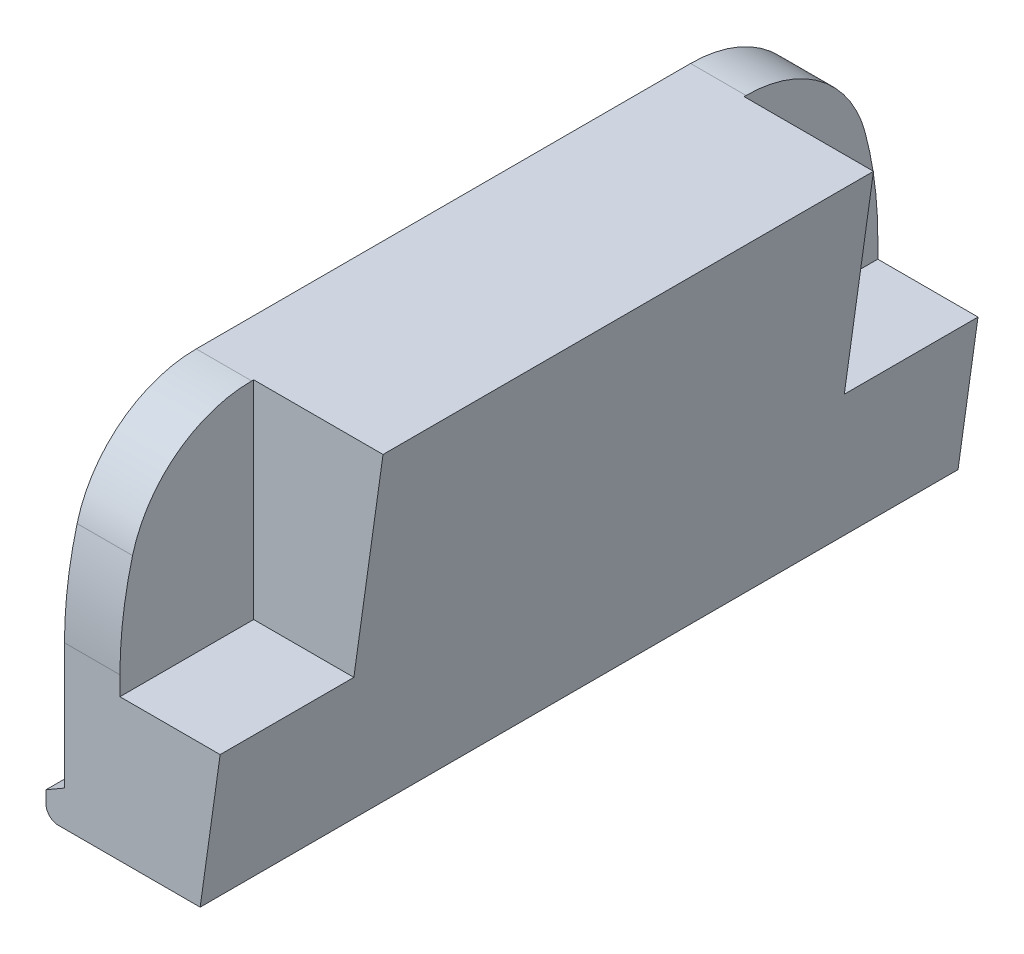
ISO-10303-21;
HEADER;
FILE_DESCRIPTION(('STEP AP214'),'2;1');
FILE_NAME('part.step','',(''),(''),'','','');
FILE_SCHEMA(('AUTOMOTIVE_DESIGN { 1 0 10303 214 1 1 1 1 }'));
ENDSEC;
DATA;
#1=APPLICATION_CONTEXT('core data for automotive mechanical design processes');
#2=APPLICATION_PROTOCOL_DEFINITION('international standard','automotive_design',2000,#1);
#3=PRODUCT_CONTEXT('',#1,'mechanical');
#4=PRODUCT('Part','Part','',(#3));
#5=PRODUCT_RELATED_PRODUCT_CATEGORY('part','',(#4));
#6=PRODUCT_DEFINITION_FORMATION('','',#4);
#7=PRODUCT_DEFINITION_CONTEXT('part definition',#1,'design');
#8=PRODUCT_DEFINITION('design','',#6,#7);
#9=PRODUCT_DEFINITION_SHAPE('','',#8);
#10=(LENGTH_UNIT() NAMED_UNIT(*) SI_UNIT(.MILLI.,.METRE.));
#11=(NAMED_UNIT(*) PLANE_ANGLE_UNIT() SI_UNIT($,.RADIAN.));
#12=(NAMED_UNIT(*) SI_UNIT($,.STERADIAN.) SOLID_ANGLE_UNIT());
#13=UNCERTAINTY_MEASURE_WITH_UNIT(LENGTH_MEASURE(1.E-05),#10,'distance_accuracy_value','');
#14=(GEOMETRIC_REPRESENTATION_CONTEXT(3) GLOBAL_UNCERTAINTY_ASSIGNED_CONTEXT((#13)) GLOBAL_UNIT_ASSIGNED_CONTEXT((#10,
#11,#12)) REPRESENTATION_CONTEXT('',''));
#15=CARTESIAN_POINT('',(0.,0.,0.));
#16=DIRECTION('',(0.,0.,1.));
#17=DIRECTION('',(1.,0.,0.));
#18=AXIS2_PLACEMENT_3D('',#15,#16,#17);
#19=CARTESIAN_POINT('',(0.299997713090983,1.78159871871872,12.3));
#20=DIRECTION('',(1.,0.,0.));
#21=DIRECTION('',(0.,0.,-1.));
#22=AXIS2_PLACEMENT_3D('',#19,#20,#21);
#23=PLANE('',#22);
#24=CARTESIAN_POINT('',(0.299997713090983,2.21592966698313,6.14964107341044));
#25=DIRECTION('',(1.,0.,0.));
#26=DIRECTION('',(0.,0.,1.));
#27=AXIS2_PLACEMENT_3D('',#24,#25,#26);
#28=CIRCLE('',#27,6.15035892658956);
#29=CARTESIAN_POINT('',(0.299997713090983,3.78899475901144,12.095427913024));
#30=VERTEX_POINT('',#29);
#31=CARTESIAN_POINT('',(0.299997713090983,2.21592966698313,12.3));
#32=VERTEX_POINT('',#31);
#33=EDGE_CURVE('E248',#30,#32,#28,.T.);
#34=ORIENTED_EDGE('',*,*,#33,.F.);
#35=CARTESIAN_POINT('',(0.299997713090983,3.27745872971482,10.1619515385287));
#36=DIRECTION('',(1.,0.,0.));
#37=DIRECTION('',(0.,0.,-1.));
#38=AXIS2_PLACEMENT_3D('',#35,#36,#37);
#39=CIRCLE('',#38,2.);
#40=CARTESIAN_POINT('',(0.299997713090983,5.27745872971482,10.1619515385287));
#41=VERTEX_POINT('',#40);
#42=EDGE_CURVE('E227',#30,#41,#39,.F.);
#43=ORIENTED_EDGE('',*,*,#42,.T.);
#44=DIRECTION('',(0.,0.,1.));
#45=VECTOR('',#44,1.);
#46=CARTESIAN_POINT('',(0.299997713090983,5.27745872971482,-0.552242211652792));
#47=LINE('',#46,#45);
#48=CARTESIAN_POINT('',(0.299997713090983,5.27745872971482,2.13804846147129));
#49=VERTEX_POINT('',#48);
#50=EDGE_CURVE('E318',#49,#41,#47,.T.);
#51=ORIENTED_EDGE('',*,*,#50,.F.);
#52=CARTESIAN_POINT('',(0.299997713090983,3.27745872971482,2.13804846147129));
#53=DIRECTION('',(1.,0.,0.));
#54=DIRECTION('',(0.,0.,-1.));
#55=AXIS2_PLACEMENT_3D('',#52,#53,#54);
#56=CIRCLE('',#55,2.);
#57=CARTESIAN_POINT('',(0.299997713090983,3.78899475901144,0.204572086976));
#58=VERTEX_POINT('',#57);
#59=EDGE_CURVE('E225',#49,#58,#56,.F.);
#60=ORIENTED_EDGE('',*,*,#59,.T.);
#61=CARTESIAN_POINT('',(0.299997713090983,2.21592966698313,6.15035892658956));
#62=DIRECTION('',(1.,0.,0.));
#63=DIRECTION('',(0.,0.,-1.));
#64=AXIS2_PLACEMENT_3D('',#61,#62,#63);
#65=CIRCLE('',#64,6.15035892658956);
#66=CARTESIAN_POINT('',(0.299997713090983,2.21592966698313,0.));
#67=VERTEX_POINT('',#66);
#68=EDGE_CURVE('E240',#67,#58,#65,.T.);
#69=ORIENTED_EDGE('',*,*,#68,.F.);
#70=DIRECTION('',(0.,-1.,0.));
#71=VECTOR('',#70,1.);
#72=CARTESIAN_POINT('',(0.299997713090983,1.78159871871872,0.));
#73=LINE('',#72,#71);
#74=CARTESIAN_POINT('',(0.299997713090983,0.173208718718719,0.));
#75=VERTEX_POINT('',#74);
#76=EDGE_CURVE('E200',#67,#75,#73,.T.);
#77=ORIENTED_EDGE('',*,*,#76,.T.);
#78=DIRECTION('',(0.,0.,-1.));
#79=VECTOR('',#78,1.);
#80=CARTESIAN_POINT('',(0.299997713090983,0.173208718718719,12.3));
#81=LINE('',#80,#79);
#82=CARTESIAN_POINT('',(0.299997713090983,0.173208718718719,12.3));
#83=VERTEX_POINT('',#82);
#84=EDGE_CURVE('E214',#83,#75,#81,.T.);
#85=ORIENTED_EDGE('',*,*,#84,.F.);
#86=DIRECTION('',(0.,-1.,0.));
#87=VECTOR('',#86,1.);
#88=CARTESIAN_POINT('',(0.299997713090982,6.10745871871872,12.3));
#89=LINE('',#88,#87);
#90=EDGE_CURVE('E294',#32,#83,#89,.T.);
#91=ORIENTED_EDGE('',*,*,#90,.F.);
#92=EDGE_LOOP('',(#34,#43,#51,#60,#69,#77,#85,#91));
#93=FACE_BOUND('',#92,.T.);
#94=DIRECTION('',(0.,0.,1.));
#95=VECTOR('',#94,1.);
#96=CARTESIAN_POINT('',(0.299997713090983,4.37320871871872,2.9660396702713));
#97=LINE('',#96,#95);
#98=CARTESIAN_POINT('',(0.299997713090983,4.37320871871872,4.65));
#99=VERTEX_POINT('',#98);
#100=CARTESIAN_POINT('',(0.299997713090983,4.37320871871872,7.65));
#101=VERTEX_POINT('',#100);
#102=EDGE_CURVE('E341',#99,#101,#97,.T.);
#103=ORIENTED_EDGE('',*,*,#102,.T.);
#104=DIRECTION('',(0.,1.,0.));
#105=VECTOR('',#104,1.);
#106=CARTESIAN_POINT('',(0.299997713090983,2.78159871871872,7.65));
#107=LINE('',#106,#105);
#108=CARTESIAN_POINT('',(0.299997713090983,1.78159871871872,7.65));
#109=VERTEX_POINT('',#108);
#110=EDGE_CURVE('E350',#109,#101,#107,.T.);
#111=ORIENTED_EDGE('',*,*,#110,.F.);
#112=DIRECTION('',(0.,0.,1.));
#113=VECTOR('',#112,1.);
#114=CARTESIAN_POINT('',(0.299997713090983,1.78159871871872,4.65));
#115=LINE('',#114,#113);
#116=CARTESIAN_POINT('',(0.299997713090983,1.78159871871872,4.65));
#117=VERTEX_POINT('',#116);
#118=EDGE_CURVE('E361',#117,#109,#115,.T.);
#119=ORIENTED_EDGE('',*,*,#118,.F.);
#120=DIRECTION('',(0.,-1.,0.));
#121=VECTOR('',#120,1.);
#122=CARTESIAN_POINT('',(0.299997713090983,2.78159871871872,4.65));
#123=LINE('',#122,#121);
#124=EDGE_CURVE('E340',#99,#117,#123,.T.);
#125=ORIENTED_EDGE('',*,*,#124,.F.);
#126=EDGE_LOOP('',(#103,#111,#119,#125));
#127=FACE_BOUND('',#126,.T.);
#128=ADVANCED_FACE('F33',(#93,#127),#23,.F.);
#129=CARTESIAN_POINT('',(0.2,-0.2,0.));
#130=DIRECTION('',(0.,0.,-1.));
#131=DIRECTION('',(-1.,0.,0.));
#132=AXIS2_PLACEMENT_3D('',#129,#130,#131);
#133=PLANE('',#132);
#134=DIRECTION('',(-0.139173100960058,-0.990268068741571,0.));
#135=VECTOR('',#134,1.);
#136=CARTESIAN_POINT('',(2.50208292422852,-0.4,0.));
#137=LINE('',#136,#135);
#138=CARTESIAN_POINT('',(2.82637509859855,1.90745871871872,0.));
#139=VERTEX_POINT('',#138);
#140=CARTESIAN_POINT('',(2.50208292422852,-0.4,0.));
#141=VERTEX_POINT('',#140);
#142=EDGE_CURVE('E178',#139,#141,#137,.T.);
#143=ORIENTED_EDGE('',*,*,#142,.T.);
#144=DIRECTION('',(1.,0.,0.));
#145=VECTOR('',#144,1.);
#146=CARTESIAN_POINT('',(3.29999771309098,-0.399999999999999,0.));
#147=LINE('',#146,#145);
#148=CARTESIAN_POINT('',(0.200000000000001,-0.4,0.));
#149=VERTEX_POINT('',#148);
#150=EDGE_CURVE('E192',#149,#141,#147,.T.);
#151=ORIENTED_EDGE('',*,*,#150,.F.);
#152=CARTESIAN_POINT('',(0.2,-0.2,0.));
#153=DIRECTION('',(0.,0.,1.));
#154=DIRECTION('',(-1.,0.,0.));
#155=AXIS2_PLACEMENT_3D('',#152,#153,#154);
#156=CIRCLE('',#155,0.2);
#157=CARTESIAN_POINT('',(0.,-0.199999999999999,0.));
#158=VERTEX_POINT('',#157);
#159=EDGE_CURVE('E201',#158,#149,#156,.T.);
#160=ORIENTED_EDGE('',*,*,#159,.F.);
#161=DIRECTION('',(0.,-1.,0.));
#162=VECTOR('',#161,1.);
#163=CARTESIAN_POINT('',(0.,0.,0.));
#164=LINE('',#163,#162);
#165=CARTESIAN_POINT('',(0.,0.,0.));
#166=VERTEX_POINT('',#165);
#167=EDGE_CURVE('E205',#166,#158,#164,.T.);
#168=ORIENTED_EDGE('',*,*,#167,.F.);
#169=DIRECTION('',(-0.866019205828305,-0.500010735021271,0.));
#170=VECTOR('',#169,1.);
#171=CARTESIAN_POINT('',(0.,0.,0.));
#172=LINE('',#171,#170);
#173=EDGE_CURVE('E203',#75,#166,#172,.T.);
#174=ORIENTED_EDGE('',*,*,#173,.F.);
#175=ORIENTED_EDGE('',*,*,#76,.F.);
#176=DIRECTION('',(-1.,0.,0.));
#177=VECTOR('',#176,1.);
#178=CARTESIAN_POINT('',(5.52551835218582,2.21592966698313,0.));
#179=LINE('',#178,#177);
#180=CARTESIAN_POINT('',(1.19999771309098,2.21592966698313,0.));
#181=VERTEX_POINT('',#180);
#182=EDGE_CURVE('E249',#181,#67,#179,.T.);
#183=ORIENTED_EDGE('',*,*,#182,.F.);
#184=DIRECTION('',(0.,1.,0.));
#185=VECTOR('',#184,1.);
#186=CARTESIAN_POINT('',(1.19999771309098,1.90745871871872,0.));
#187=LINE('',#186,#185);
#188=CARTESIAN_POINT('',(1.19999771309098,1.90745871871872,0.));
#189=VERTEX_POINT('',#188);
#190=EDGE_CURVE('E247',#189,#181,#187,.T.);
#191=ORIENTED_EDGE('',*,*,#190,.F.);
#192=DIRECTION('',(-1.,0.,0.));
#193=VECTOR('',#192,1.);
#194=CARTESIAN_POINT('',(3.29999771309098,1.90745871871872,0.));
#195=LINE('',#194,#193);
#196=EDGE_CURVE('E194',#139,#189,#195,.T.);
#197=ORIENTED_EDGE('',*,*,#196,.F.);
#198=EDGE_LOOP('',(#143,#151,#160,#168,#174,#175,#183,#191,#197));
#199=FACE_BOUND('',#198,.T.);
#200=ADVANCED_FACE('F191',(#199),#133,.T.);
#201=CARTESIAN_POINT('',(0.2,-0.2,12.3));
#202=DIRECTION('',(0.,0.,-1.));
#203=DIRECTION('',(-1.,0.,0.));
#204=AXIS2_PLACEMENT_3D('',#201,#202,#203);
#205=PLANE('',#204);
#206=DIRECTION('',(1.,0.,0.));
#207=VECTOR('',#206,1.);
#208=CARTESIAN_POINT('',(3.29999771309098,-0.399999999999999,12.3));
#209=LINE('',#208,#207);
#210=CARTESIAN_POINT('',(0.200000000000001,-0.4,12.3));
#211=VERTEX_POINT('',#210);
#212=CARTESIAN_POINT('',(2.50208292422852,-0.4,12.3));
#213=VERTEX_POINT('',#212);
#214=EDGE_CURVE('E292',#211,#213,#209,.T.);
#215=ORIENTED_EDGE('',*,*,#214,.T.);
#216=DIRECTION('',(-0.139173100960058,-0.990268068741571,0.));
#217=VECTOR('',#216,1.);
#218=CARTESIAN_POINT('',(2.50208292422852,-0.4,12.3));
#219=LINE('',#218,#217);
#220=CARTESIAN_POINT('',(2.82637509859855,1.90745871871872,12.3));
#221=VERTEX_POINT('',#220);
#222=EDGE_CURVE('E181',#221,#213,#219,.T.);
#223=ORIENTED_EDGE('',*,*,#222,.F.);
#224=DIRECTION('',(1.,0.,0.));
#225=VECTOR('',#224,1.);
#226=CARTESIAN_POINT('',(3.29999771309098,1.90745871871872,12.3));
#227=LINE('',#226,#225);
#228=CARTESIAN_POINT('',(1.19999771309098,1.90745871871872,12.3));
#229=VERTEX_POINT('',#228);
#230=EDGE_CURVE('E268',#229,#221,#227,.T.);
#231=ORIENTED_EDGE('',*,*,#230,.F.);
#232=DIRECTION('',(0.,1.,0.));
#233=VECTOR('',#232,1.);
#234=CARTESIAN_POINT('',(1.19999771309098,1.90745871871872,12.3));
#235=LINE('',#234,#233);
#236=CARTESIAN_POINT('',(1.19999771309098,2.21592966698313,12.3));
#237=VERTEX_POINT('',#236);
#238=EDGE_CURVE('E272',#229,#237,#235,.T.);
#239=ORIENTED_EDGE('',*,*,#238,.T.);
#240=DIRECTION('',(-1.,0.,0.));
#241=VECTOR('',#240,1.);
#242=CARTESIAN_POINT('',(5.52551835218582,2.21592966698313,12.3));
#243=LINE('',#242,#241);
#244=EDGE_CURVE('E251',#237,#32,#243,.T.);
#245=ORIENTED_EDGE('',*,*,#244,.T.);
#246=ORIENTED_EDGE('',*,*,#90,.T.);
#247=DIRECTION('',(-0.866019205828305,-0.500010735021271,0.));
#248=VECTOR('',#247,1.);
#249=CARTESIAN_POINT('',(0.,0.,12.3));
#250=LINE('',#249,#248);
#251=CARTESIAN_POINT('',(0.,0.,12.3));
#252=VERTEX_POINT('',#251);
#253=EDGE_CURVE('E215',#83,#252,#250,.T.);
#254=ORIENTED_EDGE('',*,*,#253,.T.);
#255=DIRECTION('',(0.,-1.,0.));
#256=VECTOR('',#255,1.);
#257=CARTESIAN_POINT('',(0.,0.,12.3));
#258=LINE('',#257,#256);
#259=CARTESIAN_POINT('',(0.,-0.199999999999999,12.3));
#260=VERTEX_POINT('',#259);
#261=EDGE_CURVE('E210',#252,#260,#258,.T.);
#262=ORIENTED_EDGE('',*,*,#261,.T.);
#263=CARTESIAN_POINT('',(0.2,-0.2,12.3));
#264=DIRECTION('',(0.,0.,1.));
#265=DIRECTION('',(-1.,0.,0.));
#266=AXIS2_PLACEMENT_3D('',#263,#264,#265);
#267=CIRCLE('',#266,0.2);
#268=EDGE_CURVE('E290',#260,#211,#267,.T.);
#269=ORIENTED_EDGE('',*,*,#268,.T.);
#270=EDGE_LOOP('',(#215,#223,#231,#239,#245,#246,#254,#262,#269));
#271=FACE_BOUND('',#270,.T.);
#272=ADVANCED_FACE('F308',(#271),#205,.F.);
#273=CARTESIAN_POINT('',(0.,0.,12.3));
#274=DIRECTION('',(1.,0.,0.));
#275=DIRECTION('',(0.,1.,0.));
#276=AXIS2_PLACEMENT_3D('',#273,#274,#275);
#277=PLANE('',#276);
#278=ORIENTED_EDGE('',*,*,#167,.T.);
#279=DIRECTION('',(0.,0.,-1.));
#280=VECTOR('',#279,1.);
#281=CARTESIAN_POINT('',(0.,-0.199999999999999,12.3));
#282=LINE('',#281,#280);
#283=EDGE_CURVE('E219',#260,#158,#282,.T.);
#284=ORIENTED_EDGE('',*,*,#283,.F.);
#285=ORIENTED_EDGE('',*,*,#261,.F.);
#286=DIRECTION('',(0.,0.,-1.));
#287=VECTOR('',#286,1.);
#288=CARTESIAN_POINT('',(0.,0.,12.3));
#289=LINE('',#288,#287);
#290=EDGE_CURVE('E211',#252,#166,#289,.T.);
#291=ORIENTED_EDGE('',*,*,#290,.T.);
#292=EDGE_LOOP('',(#278,#284,#285,#291));
#293=FACE_BOUND('',#292,.T.);
#294=ADVANCED_FACE('F300',(#293),#277,.F.);
#295=CARTESIAN_POINT('',(0.2,-0.2,12.3));
#296=DIRECTION('',(0.,0.,-1.));
#297=DIRECTION('',(-1.,0.,0.));
#298=AXIS2_PLACEMENT_3D('',#295,#296,#297);
#299=CYLINDRICAL_SURFACE('',#298,0.2);
#300=ORIENTED_EDGE('',*,*,#159,.T.);
#301=DIRECTION('',(0.,0.,-1.));
#302=VECTOR('',#301,1.);
#303=CARTESIAN_POINT('',(0.200000000000001,-0.4,12.3));
#304=LINE('',#303,#302);
#305=EDGE_CURVE('E199',#211,#149,#304,.T.);
#306=ORIENTED_EDGE('',*,*,#305,.F.);
#307=ORIENTED_EDGE('',*,*,#268,.F.);
#308=ORIENTED_EDGE('',*,*,#283,.T.);
#309=EDGE_LOOP('',(#300,#306,#307,#308));
#310=FACE_BOUND('',#309,.T.);
#311=ADVANCED_FACE('F306',(#310),#299,.T.);
#312=CARTESIAN_POINT('',(3.29999771309098,-0.399999999999999,12.3));
#313=DIRECTION('',(0.,1.,0.));
#314=DIRECTION('',(-1.,0.,0.));
#315=AXIS2_PLACEMENT_3D('',#312,#313,#314);
#316=PLANE('',#315);
#317=ORIENTED_EDGE('',*,*,#150,.T.);
#318=DIRECTION('',(0.,0.,1.));
#319=VECTOR('',#318,1.);
#320=CARTESIAN_POINT('',(2.50208292422852,-0.4,0.));
#321=LINE('',#320,#319);
#322=EDGE_CURVE('E175',#141,#213,#321,.T.);
#323=ORIENTED_EDGE('',*,*,#322,.T.);
#324=ORIENTED_EDGE('',*,*,#214,.F.);
#325=ORIENTED_EDGE('',*,*,#305,.T.);
#326=EDGE_LOOP('',(#317,#323,#324,#325));
#327=FACE_BOUND('',#326,.T.);
#328=ADVANCED_FACE('F197',(#327),#316,.F.);
#329=CARTESIAN_POINT('',(0.,0.,12.3));
#330=DIRECTION('',(0.500010735021271,-0.866019205828305,0.));
#331=DIRECTION('',(0.866019205828305,0.500010735021271,0.));
#332=AXIS2_PLACEMENT_3D('',#329,#330,#331);
#333=PLANE('',#332);
#334=ORIENTED_EDGE('',*,*,#173,.T.);
#335=ORIENTED_EDGE('',*,*,#290,.F.);
#336=ORIENTED_EDGE('',*,*,#253,.F.);
#337=ORIENTED_EDGE('',*,*,#84,.T.);
#338=EDGE_LOOP('',(#334,#335,#336,#337));
#339=FACE_BOUND('',#338,.T.);
#340=ADVANCED_FACE('F313',(#339),#333,.F.);
#341=CARTESIAN_POINT('',(3.29999771309098,1.90745871871872,2.17));
#342=DIRECTION('',(0.,0.,1.));
#343=DIRECTION('',(1.,0.,0.));
#344=AXIS2_PLACEMENT_3D('',#341,#342,#343);
#345=PLANE('',#344);
#346=DIRECTION('',(1.,0.,0.));
#347=VECTOR('',#346,1.);
#348=CARTESIAN_POINT('',(3.29999771309098,5.27745872971482,2.17));
#349=LINE('',#348,#347);
#350=CARTESIAN_POINT('',(1.19999771309098,5.27745872971482,2.17));
#351=VERTEX_POINT('',#350);
#352=CARTESIAN_POINT('',(3.29999771309098,5.27745872971482,2.17));
#353=VERTEX_POINT('',#352);
#354=EDGE_CURVE('E324',#351,#353,#349,.T.);
#355=ORIENTED_EDGE('',*,*,#354,.T.);
#356=DIRECTION('',(-0.139173100960058,-0.990268068741571,0.));
#357=VECTOR('',#356,1.);
#358=CARTESIAN_POINT('',(2.83554876702389,1.97273276127563,2.17));
#359=LINE('',#358,#357);
#360=CARTESIAN_POINT('',(2.82637509859855,1.90745871871872,2.17));
#361=VERTEX_POINT('',#360);
#362=EDGE_CURVE('E435',#353,#361,#359,.T.);
#363=ORIENTED_EDGE('',*,*,#362,.T.);
#364=DIRECTION('',(1.,0.,0.));
#365=VECTOR('',#364,1.);
#366=CARTESIAN_POINT('',(3.29999771309098,1.90745871871872,2.17));
#367=LINE('',#366,#365);
#368=CARTESIAN_POINT('',(1.19999771309098,1.90745871871872,2.17));
#369=VERTEX_POINT('',#368);
#370=EDGE_CURVE('E281',#369,#361,#367,.T.);
#371=ORIENTED_EDGE('',*,*,#370,.F.);
#372=DIRECTION('',(0.,1.,0.));
#373=VECTOR('',#372,1.);
#374=CARTESIAN_POINT('',(1.19999771309098,1.90745871871872,2.17));
#375=LINE('',#374,#373);
#376=EDGE_CURVE('E284',#369,#351,#375,.T.);
#377=ORIENTED_EDGE('',*,*,#376,.T.);
#378=EDGE_LOOP('',(#355,#363,#371,#377));
#379=FACE_BOUND('',#378,.T.);
#380=ADVANCED_FACE('F433',(#379),#345,.F.);
#381=CARTESIAN_POINT('',(1.19999771309098,1.90745871871872,0.));
#382=DIRECTION('',(-1.,0.,0.));
#383=DIRECTION('',(0.,0.,1.));
#384=AXIS2_PLACEMENT_3D('',#381,#382,#383);
#385=PLANE('',#384);
#386=CARTESIAN_POINT('',(1.19999771309098,2.21592966698313,6.15035892658956));
#387=DIRECTION('',(-1.,0.,0.));
#388=DIRECTION('',(0.,0.,1.));
#389=AXIS2_PLACEMENT_3D('',#386,#387,#388);
#390=CIRCLE('',#389,6.15035892658956);
#391=CARTESIAN_POINT('',(1.19999771309098,3.78899475901144,0.204572086976));
#392=VERTEX_POINT('',#391);
#393=EDGE_CURVE('E237',#392,#181,#390,.T.);
#394=ORIENTED_EDGE('',*,*,#393,.F.);
#395=CARTESIAN_POINT('',(1.19999771309098,3.27745872971482,2.13804846147129));
#396=DIRECTION('',(-1.,0.,0.));
#397=DIRECTION('',(0.,0.,1.));
#398=AXIS2_PLACEMENT_3D('',#395,#396,#397);
#399=CIRCLE('',#398,2.);
#400=CARTESIAN_POINT('',(1.19999771309098,5.27745872971482,2.13804846147129));
#401=VERTEX_POINT('',#400);
#402=EDGE_CURVE('E11',#392,#401,#399,.F.);
#403=ORIENTED_EDGE('',*,*,#402,.T.);
#404=DIRECTION('',(0.,0.,1.));
#405=VECTOR('',#404,1.);
#406=CARTESIAN_POINT('',(1.19999771309098,5.27745872971482,0.));
#407=LINE('',#406,#405);
#408=EDGE_CURVE('E321',#401,#351,#407,.T.);
#409=ORIENTED_EDGE('',*,*,#408,.T.);
#410=ORIENTED_EDGE('',*,*,#376,.F.);
#411=DIRECTION('',(0.,0.,1.));
#412=VECTOR('',#411,1.);
#413=CARTESIAN_POINT('',(1.19999771309098,1.90745871871872,0.));
#414=LINE('',#413,#412);
#415=EDGE_CURVE('E278',#189,#369,#414,.T.);
#416=ORIENTED_EDGE('',*,*,#415,.F.);
#417=ORIENTED_EDGE('',*,*,#190,.T.);
#418=EDGE_LOOP('',(#394,#403,#409,#410,#416,#417));
#419=FACE_BOUND('',#418,.T.);
#420=ADVANCED_FACE('F244',(#419),#385,.F.);
#421=CARTESIAN_POINT('',(0.,1.90745871871872,0.));
#422=DIRECTION('',(0.,-1.,0.));
#423=DIRECTION('',(0.,0.,-1.));
#424=AXIS2_PLACEMENT_3D('',#421,#422,#423);
#425=PLANE('',#424);
#426=ORIENTED_EDGE('',*,*,#370,.T.);
#427=DIRECTION('',(0.,0.,-1.));
#428=VECTOR('',#427,1.);
#429=CARTESIAN_POINT('',(2.82637509859855,1.90745871871872,0.));
#430=LINE('',#429,#428);
#431=EDGE_CURVE('E438',#361,#139,#430,.T.);
#432=ORIENTED_EDGE('',*,*,#431,.T.);
#433=ORIENTED_EDGE('',*,*,#196,.T.);
#434=ORIENTED_EDGE('',*,*,#415,.T.);
#435=EDGE_LOOP('',(#426,#432,#433,#434));
#436=FACE_BOUND('',#435,.T.);
#437=ADVANCED_FACE('F437',(#436),#425,.F.);
#438=CARTESIAN_POINT('',(1.19999771309098,1.90745871871872,12.3));
#439=DIRECTION('',(-1.,0.,0.));
#440=DIRECTION('',(0.,0.,1.));
#441=AXIS2_PLACEMENT_3D('',#438,#439,#440);
#442=PLANE('',#441);
#443=DIRECTION('',(0.,0.,1.));
#444=VECTOR('',#443,1.);
#445=CARTESIAN_POINT('',(1.19999771309098,5.27745872971482,12.3));
#446=LINE('',#445,#444);
#447=CARTESIAN_POINT('',(1.19999771309098,5.27745872971482,10.13));
#448=VERTEX_POINT('',#447);
#449=CARTESIAN_POINT('',(1.19999771309098,5.27745872971482,10.1619515385287));
#450=VERTEX_POINT('',#449);
#451=EDGE_CURVE('E327',#448,#450,#446,.T.);
#452=ORIENTED_EDGE('',*,*,#451,.T.);
#453=CARTESIAN_POINT('',(1.19999771309098,3.27745872971482,10.1619515385287));
#454=DIRECTION('',(-1.,0.,0.));
#455=DIRECTION('',(0.,0.,1.));
#456=AXIS2_PLACEMENT_3D('',#453,#454,#455);
#457=CIRCLE('',#456,2.);
#458=CARTESIAN_POINT('',(1.19999771309098,3.78899475901144,12.095427913024));
#459=VERTEX_POINT('',#458);
#460=EDGE_CURVE('E232',#450,#459,#457,.F.);
#461=ORIENTED_EDGE('',*,*,#460,.T.);
#462=CARTESIAN_POINT('',(1.19999771309098,2.21592966698313,6.14964107341044));
#463=DIRECTION('',(-1.,0.,0.));
#464=DIRECTION('',(0.,0.,1.));
#465=AXIS2_PLACEMENT_3D('',#462,#463,#464);
#466=CIRCLE('',#465,6.15035892658956);
#467=EDGE_CURVE('E259',#237,#459,#466,.T.);
#468=ORIENTED_EDGE('',*,*,#467,.F.);
#469=ORIENTED_EDGE('',*,*,#238,.F.);
#470=DIRECTION('',(0.,0.,1.));
#471=VECTOR('',#470,1.);
#472=CARTESIAN_POINT('',(1.19999771309098,1.90745871871872,12.3));
#473=LINE('',#472,#471);
#474=CARTESIAN_POINT('',(1.19999771309098,1.90745871871872,10.13));
#475=VERTEX_POINT('',#474);
#476=EDGE_CURVE('E266',#475,#229,#473,.T.);
#477=ORIENTED_EDGE('',*,*,#476,.F.);
#478=DIRECTION('',(0.,1.,0.));
#479=VECTOR('',#478,1.);
#480=CARTESIAN_POINT('',(1.19999771309098,1.90745871871872,10.13));
#481=LINE('',#480,#479);
#482=EDGE_CURVE('E271',#475,#448,#481,.T.);
#483=ORIENTED_EDGE('',*,*,#482,.T.);
#484=EDGE_LOOP('',(#452,#461,#468,#469,#477,#483));
#485=FACE_BOUND('',#484,.T.);
#486=ADVANCED_FACE('F415',(#485),#442,.F.);
#487=CARTESIAN_POINT('',(3.29999771309098,1.90745871871872,10.13));
#488=DIRECTION('',(0.,0.,-1.));
#489=DIRECTION('',(-1.,0.,0.));
#490=AXIS2_PLACEMENT_3D('',#487,#488,#489);
#491=PLANE('',#490);
#492=DIRECTION('',(-1.,0.,0.));
#493=VECTOR('',#492,1.);
#494=CARTESIAN_POINT('',(3.29999771309098,1.90745871871872,10.13));
#495=LINE('',#494,#493);
#496=CARTESIAN_POINT('',(2.82637509859855,1.90745871871872,10.13));
#497=VERTEX_POINT('',#496);
#498=EDGE_CURVE('E261',#497,#475,#495,.T.);
#499=ORIENTED_EDGE('',*,*,#498,.F.);
#500=DIRECTION('',(0.139173100960058,0.990268068741571,0.));
#501=VECTOR('',#500,1.);
#502=CARTESIAN_POINT('',(2.83554876702389,1.97273276127563,10.13));
#503=LINE('',#502,#501);
#504=CARTESIAN_POINT('',(3.29999771309098,5.27745872971482,10.13));
#505=VERTEX_POINT('',#504);
#506=EDGE_CURVE('E430',#497,#505,#503,.T.);
#507=ORIENTED_EDGE('',*,*,#506,.T.);
#508=DIRECTION('',(-1.,0.,0.));
#509=VECTOR('',#508,1.);
#510=CARTESIAN_POINT('',(3.29999771309098,5.27745872971482,10.13));
#511=LINE('',#510,#509);
#512=EDGE_CURVE('E333',#505,#448,#511,.T.);
#513=ORIENTED_EDGE('',*,*,#512,.T.);
#514=ORIENTED_EDGE('',*,*,#482,.F.);
#515=EDGE_LOOP('',(#499,#507,#513,#514));
#516=FACE_BOUND('',#515,.T.);
#517=ADVANCED_FACE('F428',(#516),#491,.F.);
#518=CARTESIAN_POINT('',(0.,1.90745871871872,0.));
#519=DIRECTION('',(0.,1.,0.));
#520=DIRECTION('',(0.,0.,1.));
#521=AXIS2_PLACEMENT_3D('',#518,#519,#520);
#522=PLANE('',#521);
#523=DIRECTION('',(0.,0.,1.));
#524=VECTOR('',#523,1.);
#525=CARTESIAN_POINT('',(2.82637509859855,1.90745871871872,0.));
#526=LINE('',#525,#524);
#527=EDGE_CURVE('E186',#497,#221,#526,.T.);
#528=ORIENTED_EDGE('',*,*,#527,.F.);
#529=ORIENTED_EDGE('',*,*,#498,.T.);
#530=ORIENTED_EDGE('',*,*,#476,.T.);
#531=ORIENTED_EDGE('',*,*,#230,.T.);
#532=EDGE_LOOP('',(#528,#529,#530,#531));
#533=FACE_BOUND('',#532,.T.);
#534=ADVANCED_FACE('F424',(#533),#522,.T.);
#535=CARTESIAN_POINT('',(5.52551835218582,2.21592966698313,6.14964107341044));
#536=DIRECTION('',(-1.,0.,0.));
#537=DIRECTION('',(0.,0.,1.));
#538=AXIS2_PLACEMENT_3D('',#535,#536,#537);
#539=CYLINDRICAL_SURFACE('',#538,6.15035892658956);
#540=ORIENTED_EDGE('',*,*,#467,.T.);
#541=DIRECTION('',(-1.,0.,0.));
#542=VECTOR('',#541,1.);
#543=CARTESIAN_POINT('',(5.52551835218582,3.78899475901144,12.095427913024));
#544=LINE('',#543,#542);
#545=EDGE_CURVE('E222',#459,#30,#544,.T.);
#546=ORIENTED_EDGE('',*,*,#545,.T.);
#547=ORIENTED_EDGE('',*,*,#33,.T.);
#548=ORIENTED_EDGE('',*,*,#244,.F.);
#549=EDGE_LOOP('',(#540,#546,#547,#548));
#550=FACE_BOUND('',#549,.T.);
#551=ADVANCED_FACE('F418',(#550),#539,.T.);
#552=CARTESIAN_POINT('',(5.52551835218582,2.21592966698313,6.15035892658956));
#553=DIRECTION('',(-1.,0.,0.));
#554=DIRECTION('',(0.,0.,1.));
#555=AXIS2_PLACEMENT_3D('',#552,#553,#554);
#556=CYLINDRICAL_SURFACE('',#555,6.15035892658956);
#557=ORIENTED_EDGE('',*,*,#68,.T.);
#558=DIRECTION('',(-1.,0.,0.));
#559=VECTOR('',#558,1.);
#560=CARTESIAN_POINT('',(5.52551835218582,3.78899475901144,0.204572086976));
#561=LINE('',#560,#559);
#562=EDGE_CURVE('E41',#58,#392,#561,.F.);
#563=ORIENTED_EDGE('',*,*,#562,.T.);
#564=ORIENTED_EDGE('',*,*,#393,.T.);
#565=ORIENTED_EDGE('',*,*,#182,.T.);
#566=EDGE_LOOP('',(#557,#563,#564,#565));
#567=FACE_BOUND('',#566,.T.);
#568=ADVANCED_FACE('F236',(#567),#556,.T.);
#569=CARTESIAN_POINT('',(-0.250002286909017,2.78159871871872,4.65));
#570=DIRECTION('',(0.,0.,1.));
#571=DIRECTION('',(1.,0.,0.));
#572=AXIS2_PLACEMENT_3D('',#569,#570,#571);
#573=PLANE('',#572);
#574=ORIENTED_EDGE('',*,*,#124,.T.);
#575=DIRECTION('',(1.,0.,0.));
#576=VECTOR('',#575,1.);
#577=CARTESIAN_POINT('',(-0.250002286909017,1.78159871871872,4.65));
#578=LINE('',#577,#576);
#579=CARTESIAN_POINT('',(-0.250002286909017,1.78159871871872,4.65));
#580=VERTEX_POINT('',#579);
#581=EDGE_CURVE('E256',#580,#117,#578,.T.);
#582=ORIENTED_EDGE('',*,*,#581,.F.);
#583=DIRECTION('',(0.,-1.,0.));
#584=VECTOR('',#583,1.);
#585=CARTESIAN_POINT('',(-0.250002286909017,2.78159871871872,4.65));
#586=LINE('',#585,#584);
#587=CARTESIAN_POINT('',(-0.250002286909017,2.78159871871872,4.65));
#588=VERTEX_POINT('',#587);
#589=EDGE_CURVE('E346',#588,#580,#586,.T.);
#590=ORIENTED_EDGE('',*,*,#589,.F.);
#591=DIRECTION('',(0.326611019446407,0.945158844838358,0.));
#592=VECTOR('',#591,1.);
#593=CARTESIAN_POINT('',(0.299997713090983,4.37320871871872,4.65));
#594=LINE('',#593,#592);
#595=EDGE_CURVE('E337',#588,#99,#594,.T.);
#596=ORIENTED_EDGE('',*,*,#595,.T.);
#597=EDGE_LOOP('',(#574,#582,#590,#596));
#598=FACE_BOUND('',#597,.T.);
#599=ADVANCED_FACE('F374',(#598),#573,.F.);
#600=CARTESIAN_POINT('',(-0.250002286909017,1.78159871871872,4.65));
#601=DIRECTION('',(0.,1.,0.));
#602=DIRECTION('',(0.,0.,1.));
#603=AXIS2_PLACEMENT_3D('',#600,#601,#602);
#604=PLANE('',#603);
#605=ORIENTED_EDGE('',*,*,#118,.T.);
#606=DIRECTION('',(1.,0.,0.));
#607=VECTOR('',#606,1.);
#608=CARTESIAN_POINT('',(-0.250002286909017,1.78159871871872,7.65));
#609=LINE('',#608,#607);
#610=CARTESIAN_POINT('',(-0.250002286909017,1.78159871871872,7.65));
#611=VERTEX_POINT('',#610);
#612=EDGE_CURVE('E358',#611,#109,#609,.T.);
#613=ORIENTED_EDGE('',*,*,#612,.F.);
#614=DIRECTION('',(0.,0.,1.));
#615=VECTOR('',#614,1.);
#616=CARTESIAN_POINT('',(-0.250002286909017,1.78159871871872,4.65));
#617=LINE('',#616,#615);
#618=EDGE_CURVE('E349',#580,#611,#617,.T.);
#619=ORIENTED_EDGE('',*,*,#618,.F.);
#620=ORIENTED_EDGE('',*,*,#581,.T.);
#621=EDGE_LOOP('',(#605,#613,#619,#620));
#622=FACE_BOUND('',#621,.T.);
#623=ADVANCED_FACE('F371',(#622),#604,.F.);
#624=CARTESIAN_POINT('',(-0.250002286909017,2.78159871871872,7.65));
#625=DIRECTION('',(0.,0.,-1.));
#626=DIRECTION('',(0.,1.,0.));
#627=AXIS2_PLACEMENT_3D('',#624,#625,#626);
#628=PLANE('',#627);
#629=ORIENTED_EDGE('',*,*,#110,.T.);
#630=DIRECTION('',(-0.326611019446407,-0.945158844838357,0.));
#631=VECTOR('',#630,1.);
#632=CARTESIAN_POINT('',(0.299997713090983,4.37320871871872,7.65));
#633=LINE('',#632,#631);
#634=CARTESIAN_POINT('',(-0.250002286909017,2.78159871871872,7.65));
#635=VERTEX_POINT('',#634);
#636=EDGE_CURVE('E336',#101,#635,#633,.T.);
#637=ORIENTED_EDGE('',*,*,#636,.T.);
#638=DIRECTION('',(0.,1.,0.));
#639=VECTOR('',#638,1.);
#640=CARTESIAN_POINT('',(-0.250002286909017,2.78159871871872,7.65));
#641=LINE('',#640,#639);
#642=EDGE_CURVE('E352',#611,#635,#641,.T.);
#643=ORIENTED_EDGE('',*,*,#642,.F.);
#644=ORIENTED_EDGE('',*,*,#612,.T.);
#645=EDGE_LOOP('',(#629,#637,#643,#644));
#646=FACE_BOUND('',#645,.T.);
#647=ADVANCED_FACE('F377',(#646),#628,.F.);
#648=CARTESIAN_POINT('',(-0.250002286909017,0.,0.));
#649=DIRECTION('',(-1.,0.,0.));
#650=DIRECTION('',(0.,0.,1.));
#651=AXIS2_PLACEMENT_3D('',#648,#649,#650);
#652=PLANE('',#651);
#653=ORIENTED_EDGE('',*,*,#589,.T.);
#654=ORIENTED_EDGE('',*,*,#618,.T.);
#655=ORIENTED_EDGE('',*,*,#642,.T.);
#656=DIRECTION('',(0.,0.,-1.));
#657=VECTOR('',#656,1.);
#658=CARTESIAN_POINT('',(-0.250002286909017,2.78159871871872,4.65));
#659=LINE('',#658,#657);
#660=EDGE_CURVE('E355',#635,#588,#659,.T.);
#661=ORIENTED_EDGE('',*,*,#660,.T.);
#662=EDGE_LOOP('',(#653,#654,#655,#661));
#663=FACE_BOUND('',#662,.T.);
#664=ADVANCED_FACE('F381',(#663),#652,.T.);
#665=CARTESIAN_POINT('',(0.299997713090983,4.37320871871872,2.9660396702713));
#666=DIRECTION('',(-0.945158844838358,0.326611019446407,0.));
#667=DIRECTION('',(-0.326611019446407,-0.945158844838358,0.));
#668=AXIS2_PLACEMENT_3D('',#665,#666,#667);
#669=PLANE('',#668);
#670=ORIENTED_EDGE('',*,*,#595,.F.);
#671=ORIENTED_EDGE('',*,*,#660,.F.);
#672=ORIENTED_EDGE('',*,*,#636,.F.);
#673=ORIENTED_EDGE('',*,*,#102,.F.);
#674=EDGE_LOOP('',(#670,#671,#672,#673));
#675=FACE_BOUND('',#674,.T.);
#676=ADVANCED_FACE('F379',(#675),#669,.T.);
#677=CARTESIAN_POINT('',(3.29999771309098,5.27745872971482,-0.552242211652792));
#678=DIRECTION('',(0.,-1.,0.));
#679=DIRECTION('',(0.,0.,-1.));
#680=AXIS2_PLACEMENT_3D('',#677,#678,#679);
#681=PLANE('',#680);
#682=ORIENTED_EDGE('',*,*,#50,.T.);
#683=DIRECTION('',(-1.,0.,0.));
#684=VECTOR('',#683,1.);
#685=CARTESIAN_POINT('',(3.29999771309098,5.27745872971482,10.1619515385287));
#686=LINE('',#685,#684);
#687=EDGE_CURVE('E54',#41,#450,#686,.F.);
#688=ORIENTED_EDGE('',*,*,#687,.T.);
#689=ORIENTED_EDGE('',*,*,#451,.F.);
#690=ORIENTED_EDGE('',*,*,#512,.F.);
#691=DIRECTION('',(0.,0.,1.));
#692=VECTOR('',#691,1.);
#693=CARTESIAN_POINT('',(3.29999771309098,5.27745872971482,-0.552242211652792));
#694=LINE('',#693,#692);
#695=EDGE_CURVE('E325',#353,#505,#694,.T.);
#696=ORIENTED_EDGE('',*,*,#695,.F.);
#697=ORIENTED_EDGE('',*,*,#354,.F.);
#698=ORIENTED_EDGE('',*,*,#408,.F.);
#699=DIRECTION('',(-1.,0.,0.));
#700=VECTOR('',#699,1.);
#701=CARTESIAN_POINT('',(3.29999771309098,5.27745872971482,2.13804846147129));
#702=LINE('',#701,#700);
#703=EDGE_CURVE('E229',#401,#49,#702,.T.);
#704=ORIENTED_EDGE('',*,*,#703,.T.);
#705=EDGE_LOOP('',(#682,#688,#689,#690,#696,#697,#698,#704));
#706=FACE_BOUND('',#705,.T.);
#707=ADVANCED_FACE('F319',(#706),#681,.F.);
#708=CARTESIAN_POINT('',(5.52551835218582,3.27745872971482,10.1619515385287));
#709=DIRECTION('',(-1.,0.,0.));
#710=DIRECTION('',(0.,0.,1.));
#711=AXIS2_PLACEMENT_3D('',#708,#709,#710);
#712=CYLINDRICAL_SURFACE('',#711,2.);
#713=ORIENTED_EDGE('',*,*,#460,.F.);
#714=ORIENTED_EDGE('',*,*,#687,.F.);
#715=ORIENTED_EDGE('',*,*,#42,.F.);
#716=ORIENTED_EDGE('',*,*,#545,.F.);
#717=EDGE_LOOP('',(#713,#714,#715,#716));
#718=FACE_BOUND('',#717,.T.);
#719=ADVANCED_FACE('F403',(#718),#712,.T.);
#720=CARTESIAN_POINT('',(5.52551835218582,3.27745872971482,2.13804846147129));
#721=DIRECTION('',(-1.,0.,0.));
#722=DIRECTION('',(0.,0.,1.));
#723=AXIS2_PLACEMENT_3D('',#720,#721,#722);
#724=CYLINDRICAL_SURFACE('',#723,2.);
#725=ORIENTED_EDGE('',*,*,#59,.F.);
#726=ORIENTED_EDGE('',*,*,#703,.F.);
#727=ORIENTED_EDGE('',*,*,#402,.F.);
#728=ORIENTED_EDGE('',*,*,#562,.F.);
#729=EDGE_LOOP('',(#725,#726,#727,#728));
#730=FACE_BOUND('',#729,.T.);
#731=ADVANCED_FACE('F35',(#730),#724,.T.);
#732=CARTESIAN_POINT('',(2.50208292422852,-0.4,0.));
#733=DIRECTION('',(-0.990268068741571,0.139173100960058,0.));
#734=DIRECTION('',(-0.139173100960058,-0.990268068741571,0.));
#735=AXIS2_PLACEMENT_3D('',#732,#733,#734);
#736=PLANE('',#735);
#737=ORIENTED_EDGE('',*,*,#695,.T.);
#738=ORIENTED_EDGE('',*,*,#506,.F.);
#739=ORIENTED_EDGE('',*,*,#527,.T.);
#740=ORIENTED_EDGE('',*,*,#222,.T.);
#741=ORIENTED_EDGE('',*,*,#322,.F.);
#742=ORIENTED_EDGE('',*,*,#142,.F.);
#743=ORIENTED_EDGE('',*,*,#431,.F.);
#744=ORIENTED_EDGE('',*,*,#362,.F.);
#745=EDGE_LOOP('',(#737,#738,#739,#740,#741,#742,#743,#744));
#746=FACE_BOUND('',#745,.T.);
#747=ADVANCED_FACE('F177',(#746),#736,.F.);
#748=CLOSED_SHELL('',(#128,#200,#272,#294,#311,#328,#340,#380,#420,#437,#486,#517,#534,#551,
#568,#599,#623,#647,#664,#676,#707,#719,#731,#747));
#749=MANIFOLD_SOLID_BREP('B2',#748);
#750=ADVANCED_BREP_SHAPE_REPRESENTATION('',(#18,#749),#14);
#751=SHAPE_DEFINITION_REPRESENTATION(#9,#750);
ENDSEC;
END-ISO-10303-21;
